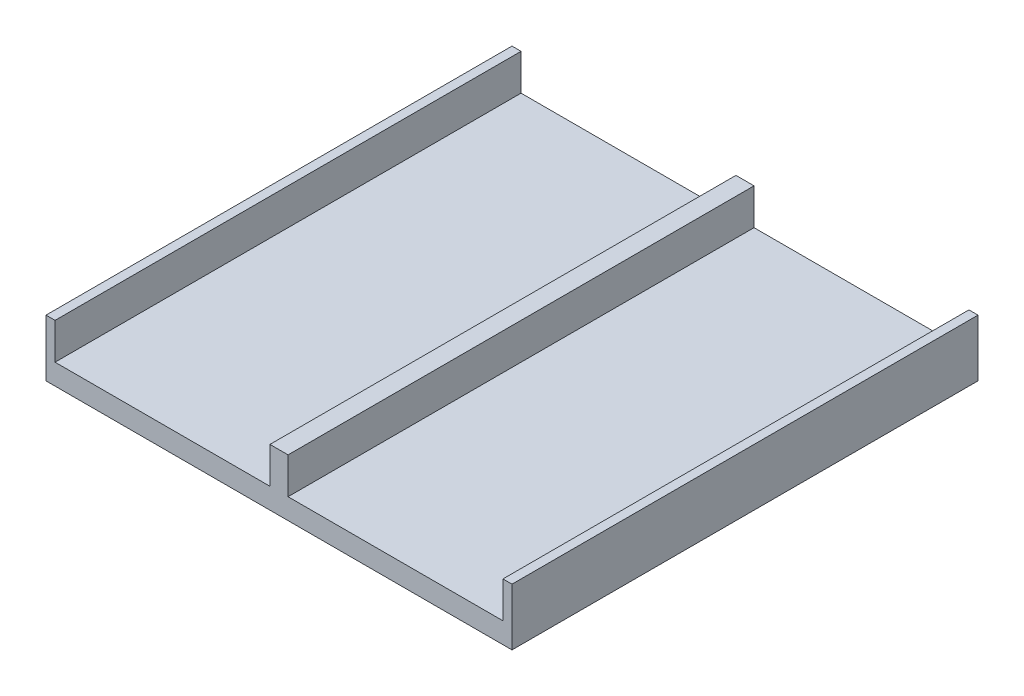
ISO-10303-21;
HEADER;
FILE_DESCRIPTION(('STEP AP214'),'2;1');
FILE_NAME('part.step','',(''),(''),'','','');
FILE_SCHEMA(('AUTOMOTIVE_DESIGN { 1 0 10303 214 1 1 1 1 }'));
ENDSEC;
DATA;
#1=APPLICATION_CONTEXT('core data for automotive mechanical design processes');
#2=APPLICATION_PROTOCOL_DEFINITION('international standard','automotive_design',2000,#1);
#3=PRODUCT_CONTEXT('',#1,'mechanical');
#4=PRODUCT('Part','Part','',(#3));
#5=PRODUCT_RELATED_PRODUCT_CATEGORY('part','',(#4));
#6=PRODUCT_DEFINITION_FORMATION('','',#4);
#7=PRODUCT_DEFINITION_CONTEXT('part definition',#1,'design');
#8=PRODUCT_DEFINITION('design','',#6,#7);
#9=PRODUCT_DEFINITION_SHAPE('','',#8);
#10=(LENGTH_UNIT() NAMED_UNIT(*) SI_UNIT(.MILLI.,.METRE.));
#11=(NAMED_UNIT(*) PLANE_ANGLE_UNIT() SI_UNIT($,.RADIAN.));
#12=(NAMED_UNIT(*) SI_UNIT($,.STERADIAN.) SOLID_ANGLE_UNIT());
#13=UNCERTAINTY_MEASURE_WITH_UNIT(LENGTH_MEASURE(1.E-05),#10,'distance_accuracy_value','');
#14=(GEOMETRIC_REPRESENTATION_CONTEXT(3) GLOBAL_UNCERTAINTY_ASSIGNED_CONTEXT((#13)) GLOBAL_UNIT_ASSIGNED_CONTEXT((#10,
#11,#12)) REPRESENTATION_CONTEXT('',''));
#15=CARTESIAN_POINT('',(0.,0.,0.));
#16=DIRECTION('',(0.,0.,1.));
#17=DIRECTION('',(1.,0.,0.));
#18=AXIS2_PLACEMENT_3D('',#15,#16,#17);
#19=CARTESIAN_POINT('',(0.,11.,0.));
#20=DIRECTION('',(0.,1.,0.));
#21=DIRECTION('',(0.,0.,1.));
#22=AXIS2_PLACEMENT_3D('',#19,#20,#21);
#23=PLANE('',#22);
#24=DIRECTION('',(0.,0.,-1.));
#25=VECTOR('',#24,1.);
#26=CARTESIAN_POINT('',(-1.75,11.,-45.));
#27=LINE('',#26,#25);
#28=CARTESIAN_POINT('',(-1.74999999999999,11.,45.));
#29=VERTEX_POINT('',#28);
#30=CARTESIAN_POINT('',(-1.75,11.,-45.));
#31=VERTEX_POINT('',#30);
#32=EDGE_CURVE('E126',#29,#31,#27,.T.);
#33=ORIENTED_EDGE('',*,*,#32,.F.);
#34=DIRECTION('',(1.,0.,0.));
#35=VECTOR('',#34,1.);
#36=CARTESIAN_POINT('',(-45.,11.,45.));
#37=LINE('',#36,#35);
#38=CARTESIAN_POINT('',(1.75000000000001,11.,45.));
#39=VERTEX_POINT('',#38);
#40=EDGE_CURVE('E199',#29,#39,#37,.T.);
#41=ORIENTED_EDGE('',*,*,#40,.T.);
#42=DIRECTION('',(0.,0.,1.));
#43=VECTOR('',#42,1.);
#44=CARTESIAN_POINT('',(1.75,11.,-45.));
#45=LINE('',#44,#43);
#46=CARTESIAN_POINT('',(1.75,11.,-45.));
#47=VERTEX_POINT('',#46);
#48=EDGE_CURVE('E173',#47,#39,#45,.T.);
#49=ORIENTED_EDGE('',*,*,#48,.F.);
#50=DIRECTION('',(-1.,0.,0.));
#51=VECTOR('',#50,1.);
#52=CARTESIAN_POINT('',(-45.,11.,-45.));
#53=LINE('',#52,#51);
#54=EDGE_CURVE('E192',#47,#31,#53,.T.);
#55=ORIENTED_EDGE('',*,*,#54,.T.);
#56=EDGE_LOOP('',(#33,#41,#49,#55));
#57=FACE_BOUND('',#56,.T.);
#58=ADVANCED_FACE('F32',(#57),#23,.T.);
#59=DIRECTION('',(0.,0.,1.));
#60=VECTOR('',#59,1.);
#61=CARTESIAN_POINT('',(-43.25,11.,-45.));
#62=LINE('',#61,#60);
#63=CARTESIAN_POINT('',(-43.25,11.,-45.));
#64=VERTEX_POINT('',#63);
#65=CARTESIAN_POINT('',(-43.25,11.,45.));
#66=VERTEX_POINT('',#65);
#67=EDGE_CURVE('E140',#64,#66,#62,.T.);
#68=ORIENTED_EDGE('',*,*,#67,.F.);
#69=CARTESIAN_POINT('',(-45.,11.,-45.));
#70=VERTEX_POINT('',#69);
#71=EDGE_CURVE('E186',#64,#70,#53,.T.);
#72=ORIENTED_EDGE('',*,*,#71,.T.);
#73=DIRECTION('',(0.,0.,1.));
#74=VECTOR('',#73,1.);
#75=CARTESIAN_POINT('',(-45.,11.,-45.));
#76=LINE('',#75,#74);
#77=CARTESIAN_POINT('',(-45.,11.,45.));
#78=VERTEX_POINT('',#77);
#79=EDGE_CURVE('E191',#70,#78,#76,.T.);
#80=ORIENTED_EDGE('',*,*,#79,.T.);
#81=EDGE_CURVE('E195',#78,#66,#37,.T.);
#82=ORIENTED_EDGE('',*,*,#81,.T.);
#83=EDGE_LOOP('',(#68,#72,#80,#82));
#84=FACE_BOUND('',#83,.T.);
#85=ADVANCED_FACE('F244',(#84),#23,.T.);
#86=CARTESIAN_POINT('',(45.,11.,-45.));
#87=DIRECTION('',(-1.,0.,0.));
#88=DIRECTION('',(0.,0.,1.));
#89=AXIS2_PLACEMENT_3D('',#86,#87,#88);
#90=PLANE('',#89);
#91=DIRECTION('',(0.,0.,-1.));
#92=VECTOR('',#91,1.);
#93=CARTESIAN_POINT('',(45.,0.,-45.));
#94=LINE('',#93,#92);
#95=CARTESIAN_POINT('',(45.,0.,45.));
#96=VERTEX_POINT('',#95);
#97=CARTESIAN_POINT('',(45.,0.,-45.));
#98=VERTEX_POINT('',#97);
#99=EDGE_CURVE('E154',#96,#98,#94,.T.);
#100=ORIENTED_EDGE('',*,*,#99,.T.);
#101=DIRECTION('',(0.,-1.,0.));
#102=VECTOR('',#101,1.);
#103=CARTESIAN_POINT('',(45.,11.,-45.));
#104=LINE('',#103,#102);
#105=CARTESIAN_POINT('',(45.,11.,-45.));
#106=VERTEX_POINT('',#105);
#107=EDGE_CURVE('E11',#106,#98,#104,.T.);
#108=ORIENTED_EDGE('',*,*,#107,.F.);
#109=DIRECTION('',(0.,0.,-1.));
#110=VECTOR('',#109,1.);
#111=CARTESIAN_POINT('',(45.,11.,-45.));
#112=LINE('',#111,#110);
#113=CARTESIAN_POINT('',(45.,11.,45.));
#114=VERTEX_POINT('',#113);
#115=EDGE_CURVE('E183',#114,#106,#112,.T.);
#116=ORIENTED_EDGE('',*,*,#115,.F.);
#117=DIRECTION('',(0.,-1.,0.));
#118=VECTOR('',#117,1.);
#119=CARTESIAN_POINT('',(45.,11.,45.));
#120=LINE('',#119,#118);
#121=EDGE_CURVE('E198',#114,#96,#120,.T.);
#122=ORIENTED_EDGE('',*,*,#121,.T.);
#123=EDGE_LOOP('',(#100,#108,#116,#122));
#124=FACE_BOUND('',#123,.T.);
#125=ADVANCED_FACE('F34',(#124),#90,.F.);
#126=CARTESIAN_POINT('',(-45.,11.,-45.));
#127=DIRECTION('',(0.,0.,1.));
#128=DIRECTION('',(1.,0.,0.));
#129=AXIS2_PLACEMENT_3D('',#126,#127,#128);
#130=PLANE('',#129);
#131=DIRECTION('',(-1.,0.,0.));
#132=VECTOR('',#131,1.);
#133=CARTESIAN_POINT('',(-43.25,4.,-45.));
#134=LINE('',#133,#132);
#135=CARTESIAN_POINT('',(-1.75,4.,-45.));
#136=VERTEX_POINT('',#135);
#137=CARTESIAN_POINT('',(-43.25,4.,-45.));
#138=VERTEX_POINT('',#137);
#139=EDGE_CURVE('E137',#136,#138,#134,.T.);
#140=ORIENTED_EDGE('',*,*,#139,.F.);
#141=DIRECTION('',(0.,1.,0.));
#142=VECTOR('',#141,1.);
#143=CARTESIAN_POINT('',(-1.75,4.,-45.));
#144=LINE('',#143,#142);
#145=EDGE_CURVE('E120',#136,#31,#144,.T.);
#146=ORIENTED_EDGE('',*,*,#145,.T.);
#147=ORIENTED_EDGE('',*,*,#54,.F.);
#148=DIRECTION('',(0.,1.,0.));
#149=VECTOR('',#148,1.);
#150=CARTESIAN_POINT('',(1.75,4.,-45.));
#151=LINE('',#150,#149);
#152=CARTESIAN_POINT('',(1.75,4.,-45.));
#153=VERTEX_POINT('',#152);
#154=EDGE_CURVE('E150',#153,#47,#151,.T.);
#155=ORIENTED_EDGE('',*,*,#154,.F.);
#156=DIRECTION('',(-1.,0.,0.));
#157=VECTOR('',#156,1.);
#158=CARTESIAN_POINT('',(1.75,4.,-45.));
#159=LINE('',#158,#157);
#160=CARTESIAN_POINT('',(43.25,4.,-45.));
#161=VERTEX_POINT('',#160);
#162=EDGE_CURVE('E169',#161,#153,#159,.T.);
#163=ORIENTED_EDGE('',*,*,#162,.F.);
#164=DIRECTION('',(0.,1.,0.));
#165=VECTOR('',#164,1.);
#166=CARTESIAN_POINT('',(43.25,4.,-45.));
#167=LINE('',#166,#165);
#168=CARTESIAN_POINT('',(43.25,11.,-45.));
#169=VERTEX_POINT('',#168);
#170=EDGE_CURVE('E177',#161,#169,#167,.T.);
#171=ORIENTED_EDGE('',*,*,#170,.T.);
#172=EDGE_CURVE('E188',#106,#169,#53,.T.);
#173=ORIENTED_EDGE('',*,*,#172,.F.);
#174=ORIENTED_EDGE('',*,*,#107,.T.);
#175=DIRECTION('',(-1.,0.,0.));
#176=VECTOR('',#175,1.);
#177=CARTESIAN_POINT('',(-45.,0.,-45.));
#178=LINE('',#177,#176);
#179=CARTESIAN_POINT('',(-45.,0.,-45.));
#180=VERTEX_POINT('',#179);
#181=EDGE_CURVE('E202',#98,#180,#178,.T.);
#182=ORIENTED_EDGE('',*,*,#181,.T.);
#183=DIRECTION('',(0.,-1.,0.));
#184=VECTOR('',#183,1.);
#185=CARTESIAN_POINT('',(-45.,11.,-45.));
#186=LINE('',#185,#184);
#187=EDGE_CURVE('E40',#70,#180,#186,.T.);
#188=ORIENTED_EDGE('',*,*,#187,.F.);
#189=ORIENTED_EDGE('',*,*,#71,.F.);
#190=DIRECTION('',(0.,1.,0.));
#191=VECTOR('',#190,1.);
#192=CARTESIAN_POINT('',(-43.25,4.,-45.));
#193=LINE('',#192,#191);
#194=EDGE_CURVE('E55',#138,#64,#193,.T.);
#195=ORIENTED_EDGE('',*,*,#194,.F.);
#196=EDGE_LOOP('',(#140,#146,#147,#155,#163,#171,#173,#174,#182,#188,#189,#195));
#197=FACE_BOUND('',#196,.T.);
#198=ADVANCED_FACE('F142',(#197),#130,.F.);
#199=CARTESIAN_POINT('',(-45.,11.,-45.));
#200=DIRECTION('',(1.,0.,0.));
#201=DIRECTION('',(0.,0.,-1.));
#202=AXIS2_PLACEMENT_3D('',#199,#200,#201);
#203=PLANE('',#202);
#204=DIRECTION('',(0.,0.,1.));
#205=VECTOR('',#204,1.);
#206=CARTESIAN_POINT('',(-45.,0.,-45.));
#207=LINE('',#206,#205);
#208=CARTESIAN_POINT('',(-45.,0.,45.));
#209=VERTEX_POINT('',#208);
#210=EDGE_CURVE('E204',#180,#209,#207,.T.);
#211=ORIENTED_EDGE('',*,*,#210,.T.);
#212=DIRECTION('',(0.,-1.,0.));
#213=VECTOR('',#212,1.);
#214=CARTESIAN_POINT('',(-45.,11.,45.));
#215=LINE('',#214,#213);
#216=EDGE_CURVE('E209',#78,#209,#215,.T.);
#217=ORIENTED_EDGE('',*,*,#216,.F.);
#218=ORIENTED_EDGE('',*,*,#79,.F.);
#219=ORIENTED_EDGE('',*,*,#187,.T.);
#220=EDGE_LOOP('',(#211,#217,#218,#219));
#221=FACE_BOUND('',#220,.T.);
#222=ADVANCED_FACE('F216',(#221),#203,.F.);
#223=CARTESIAN_POINT('',(-45.,11.,45.));
#224=DIRECTION('',(0.,0.,-1.));
#225=DIRECTION('',(-1.,0.,0.));
#226=AXIS2_PLACEMENT_3D('',#223,#224,#225);
#227=PLANE('',#226);
#228=ORIENTED_EDGE('',*,*,#40,.F.);
#229=DIRECTION('',(0.,1.,0.));
#230=VECTOR('',#229,1.);
#231=CARTESIAN_POINT('',(-1.74999999999999,4.,45.));
#232=LINE('',#231,#230);
#233=CARTESIAN_POINT('',(-1.74999999999999,4.,45.));
#234=VERTEX_POINT('',#233);
#235=EDGE_CURVE('E152',#234,#29,#232,.T.);
#236=ORIENTED_EDGE('',*,*,#235,.F.);
#237=DIRECTION('',(1.,0.,0.));
#238=VECTOR('',#237,1.);
#239=CARTESIAN_POINT('',(-43.25,4.,45.));
#240=LINE('',#239,#238);
#241=CARTESIAN_POINT('',(-43.25,4.,45.));
#242=VERTEX_POINT('',#241);
#243=EDGE_CURVE('E131',#242,#234,#240,.T.);
#244=ORIENTED_EDGE('',*,*,#243,.F.);
#245=DIRECTION('',(0.,1.,0.));
#246=VECTOR('',#245,1.);
#247=CARTESIAN_POINT('',(-43.25,4.,45.));
#248=LINE('',#247,#246);
#249=EDGE_CURVE('E155',#242,#66,#248,.T.);
#250=ORIENTED_EDGE('',*,*,#249,.T.);
#251=ORIENTED_EDGE('',*,*,#81,.F.);
#252=ORIENTED_EDGE('',*,*,#216,.T.);
#253=DIRECTION('',(1.,0.,0.));
#254=VECTOR('',#253,1.);
#255=CARTESIAN_POINT('',(-45.,0.,45.));
#256=LINE('',#255,#254);
#257=EDGE_CURVE('E187',#209,#96,#256,.T.);
#258=ORIENTED_EDGE('',*,*,#257,.T.);
#259=ORIENTED_EDGE('',*,*,#121,.F.);
#260=CARTESIAN_POINT('',(43.25,11.,45.));
#261=VERTEX_POINT('',#260);
#262=EDGE_CURVE('E194',#261,#114,#37,.T.);
#263=ORIENTED_EDGE('',*,*,#262,.F.);
#264=DIRECTION('',(0.,1.,0.));
#265=VECTOR('',#264,1.);
#266=CARTESIAN_POINT('',(43.25,4.,45.));
#267=LINE('',#266,#265);
#268=CARTESIAN_POINT('',(43.25,4.,45.));
#269=VERTEX_POINT('',#268);
#270=EDGE_CURVE('E47',#269,#261,#267,.T.);
#271=ORIENTED_EDGE('',*,*,#270,.F.);
#272=DIRECTION('',(1.,0.,0.));
#273=VECTOR('',#272,1.);
#274=CARTESIAN_POINT('',(1.75000000000001,4.,45.));
#275=LINE('',#274,#273);
#276=CARTESIAN_POINT('',(1.75000000000001,4.,45.));
#277=VERTEX_POINT('',#276);
#278=EDGE_CURVE('E162',#277,#269,#275,.T.);
#279=ORIENTED_EDGE('',*,*,#278,.F.);
#280=DIRECTION('',(0.,1.,0.));
#281=VECTOR('',#280,1.);
#282=CARTESIAN_POINT('',(1.75000000000001,4.,45.));
#283=LINE('',#282,#281);
#284=EDGE_CURVE('E172',#277,#39,#283,.T.);
#285=ORIENTED_EDGE('',*,*,#284,.T.);
#286=EDGE_LOOP('',(#228,#236,#244,#250,#251,#252,#258,#259,#263,#271,#279,#285));
#287=FACE_BOUND('',#286,.T.);
#288=ADVANCED_FACE('F225',(#287),#227,.F.);
#289=DIRECTION('',(0.,0.,-1.));
#290=VECTOR('',#289,1.);
#291=CARTESIAN_POINT('',(43.25,11.,-45.));
#292=LINE('',#291,#290);
#293=EDGE_CURVE('E163',#261,#169,#292,.T.);
#294=ORIENTED_EDGE('',*,*,#293,.F.);
#295=ORIENTED_EDGE('',*,*,#262,.T.);
#296=ORIENTED_EDGE('',*,*,#115,.T.);
#297=ORIENTED_EDGE('',*,*,#172,.T.);
#298=EDGE_LOOP('',(#294,#295,#296,#297));
#299=FACE_BOUND('',#298,.T.);
#300=ADVANCED_FACE('F232',(#299),#23,.T.);
#301=CARTESIAN_POINT('',(0.,0.,0.));
#302=DIRECTION('',(0.,1.,0.));
#303=DIRECTION('',(0.,0.,1.));
#304=AXIS2_PLACEMENT_3D('',#301,#302,#303);
#305=PLANE('',#304);
#306=ORIENTED_EDGE('',*,*,#99,.F.);
#307=ORIENTED_EDGE('',*,*,#257,.F.);
#308=ORIENTED_EDGE('',*,*,#210,.F.);
#309=ORIENTED_EDGE('',*,*,#181,.F.);
#310=EDGE_LOOP('',(#306,#307,#308,#309));
#311=FACE_BOUND('',#310,.T.);
#312=ADVANCED_FACE('F221',(#311),#305,.F.);
#313=CARTESIAN_POINT('',(1.75,4.,-45.));
#314=DIRECTION('',(-1.,0.,0.));
#315=DIRECTION('',(0.,0.,1.));
#316=AXIS2_PLACEMENT_3D('',#313,#314,#315);
#317=PLANE('',#316);
#318=ORIENTED_EDGE('',*,*,#48,.T.);
#319=ORIENTED_EDGE('',*,*,#284,.F.);
#320=DIRECTION('',(0.,0.,1.));
#321=VECTOR('',#320,1.);
#322=CARTESIAN_POINT('',(1.75,4.,-45.));
#323=LINE('',#322,#321);
#324=EDGE_CURVE('E159',#153,#277,#323,.T.);
#325=ORIENTED_EDGE('',*,*,#324,.F.);
#326=ORIENTED_EDGE('',*,*,#154,.T.);
#327=EDGE_LOOP('',(#318,#319,#325,#326));
#328=FACE_BOUND('',#327,.T.);
#329=ADVANCED_FACE('F238',(#328),#317,.F.);
#330=CARTESIAN_POINT('',(43.25,4.,-45.));
#331=DIRECTION('',(1.,0.,0.));
#332=DIRECTION('',(0.,0.,-1.));
#333=AXIS2_PLACEMENT_3D('',#330,#331,#332);
#334=PLANE('',#333);
#335=ORIENTED_EDGE('',*,*,#293,.T.);
#336=ORIENTED_EDGE('',*,*,#170,.F.);
#337=DIRECTION('',(0.,0.,-1.));
#338=VECTOR('',#337,1.);
#339=CARTESIAN_POINT('',(43.25,4.,-45.));
#340=LINE('',#339,#338);
#341=EDGE_CURVE('E166',#269,#161,#340,.T.);
#342=ORIENTED_EDGE('',*,*,#341,.F.);
#343=ORIENTED_EDGE('',*,*,#270,.T.);
#344=EDGE_LOOP('',(#335,#336,#342,#343));
#345=FACE_BOUND('',#344,.T.);
#346=ADVANCED_FACE('F308',(#345),#334,.F.);
#347=CARTESIAN_POINT('',(0.,4.,0.));
#348=DIRECTION('',(0.,1.,0.));
#349=DIRECTION('',(0.,0.,1.));
#350=AXIS2_PLACEMENT_3D('',#347,#348,#349);
#351=PLANE('',#350);
#352=ORIENTED_EDGE('',*,*,#324,.T.);
#353=ORIENTED_EDGE('',*,*,#278,.T.);
#354=ORIENTED_EDGE('',*,*,#341,.T.);
#355=ORIENTED_EDGE('',*,*,#162,.T.);
#356=EDGE_LOOP('',(#352,#353,#354,#355));
#357=FACE_BOUND('',#356,.T.);
#358=ADVANCED_FACE('F240',(#357),#351,.T.);
#359=CARTESIAN_POINT('',(-1.75,4.,-45.));
#360=DIRECTION('',(1.,0.,0.));
#361=DIRECTION('',(0.,0.,-1.));
#362=AXIS2_PLACEMENT_3D('',#359,#360,#361);
#363=PLANE('',#362);
#364=ORIENTED_EDGE('',*,*,#32,.T.);
#365=ORIENTED_EDGE('',*,*,#145,.F.);
#366=DIRECTION('',(0.,0.,-1.));
#367=VECTOR('',#366,1.);
#368=CARTESIAN_POINT('',(-1.75,4.,-45.));
#369=LINE('',#368,#367);
#370=EDGE_CURVE('E123',#234,#136,#369,.T.);
#371=ORIENTED_EDGE('',*,*,#370,.F.);
#372=ORIENTED_EDGE('',*,*,#235,.T.);
#373=EDGE_LOOP('',(#364,#365,#371,#372));
#374=FACE_BOUND('',#373,.T.);
#375=ADVANCED_FACE('F122',(#374),#363,.F.);
#376=CARTESIAN_POINT('',(-43.25,4.,-45.));
#377=DIRECTION('',(-1.,0.,0.));
#378=DIRECTION('',(0.,0.,1.));
#379=AXIS2_PLACEMENT_3D('',#376,#377,#378);
#380=PLANE('',#379);
#381=ORIENTED_EDGE('',*,*,#67,.T.);
#382=ORIENTED_EDGE('',*,*,#249,.F.);
#383=DIRECTION('',(0.,0.,1.));
#384=VECTOR('',#383,1.);
#385=CARTESIAN_POINT('',(-43.25,4.,-45.));
#386=LINE('',#385,#384);
#387=EDGE_CURVE('E144',#138,#242,#386,.T.);
#388=ORIENTED_EDGE('',*,*,#387,.F.);
#389=ORIENTED_EDGE('',*,*,#194,.T.);
#390=EDGE_LOOP('',(#381,#382,#388,#389));
#391=FACE_BOUND('',#390,.T.);
#392=ADVANCED_FACE('F245',(#391),#380,.F.);
#393=CARTESIAN_POINT('',(0.,4.,0.));
#394=DIRECTION('',(0.,1.,0.));
#395=DIRECTION('',(0.,0.,1.));
#396=AXIS2_PLACEMENT_3D('',#393,#394,#395);
#397=PLANE('',#396);
#398=ORIENTED_EDGE('',*,*,#370,.T.);
#399=ORIENTED_EDGE('',*,*,#139,.T.);
#400=ORIENTED_EDGE('',*,*,#387,.T.);
#401=ORIENTED_EDGE('',*,*,#243,.T.);
#402=EDGE_LOOP('',(#398,#399,#400,#401));
#403=FACE_BOUND('',#402,.T.);
#404=ADVANCED_FACE('F135',(#403),#397,.T.);
#405=CLOSED_SHELL('',(#58,#85,#125,#198,#222,#288,#300,#312,#329,#346,#358,#375,#392,#404));
#406=MANIFOLD_SOLID_BREP('B2',#405);
#407=ADVANCED_BREP_SHAPE_REPRESENTATION('',(#18,#406),#14);
#408=SHAPE_DEFINITION_REPRESENTATION(#9,#407);
ENDSEC;
END-ISO-10303-21;
